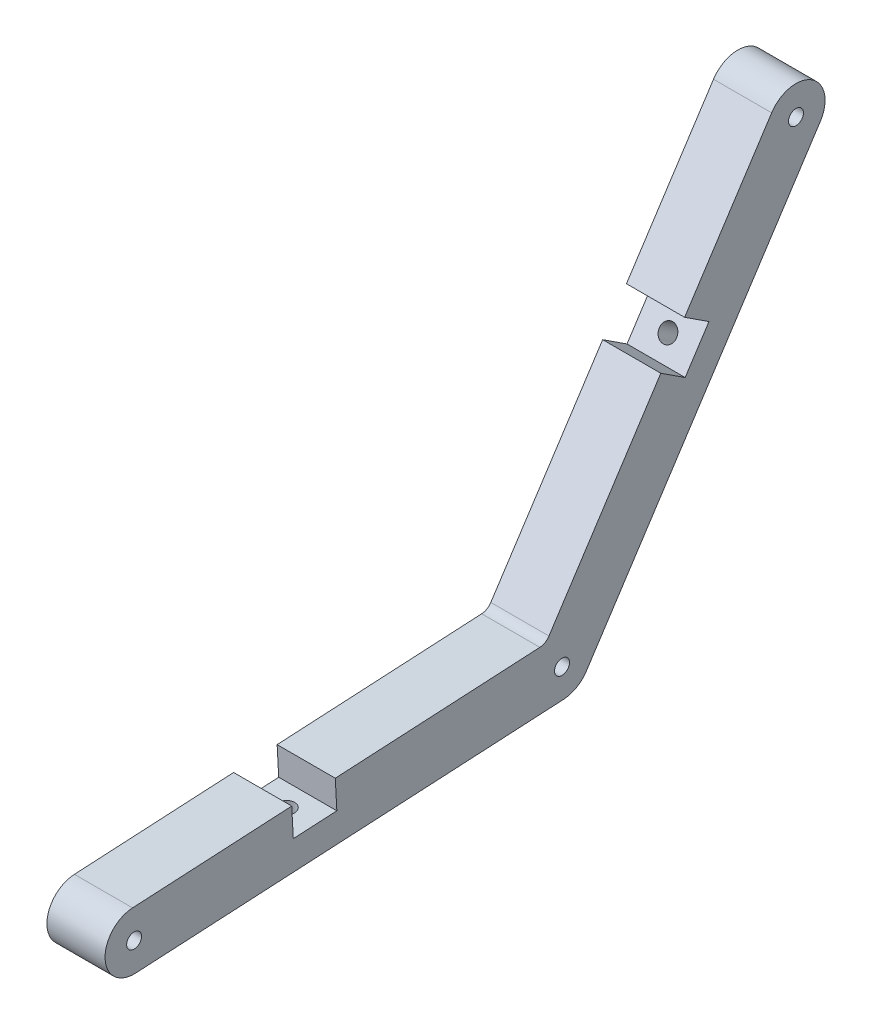
ISO-10303-21;
HEADER;
FILE_DESCRIPTION(('STEP AP214'),'2;1');
FILE_NAME('part.step','',(''),(''),'','','');
FILE_SCHEMA(('AUTOMOTIVE_DESIGN { 1 0 10303 214 1 1 1 1 }'));
ENDSEC;
DATA;
#1=APPLICATION_CONTEXT('core data for automotive mechanical design processes');
#2=APPLICATION_PROTOCOL_DEFINITION('international standard','automotive_design',2000,#1);
#3=PRODUCT_CONTEXT('',#1,'mechanical');
#4=PRODUCT('Part','Part','',(#3));
#5=PRODUCT_RELATED_PRODUCT_CATEGORY('part','',(#4));
#6=PRODUCT_DEFINITION_FORMATION('','',#4);
#7=PRODUCT_DEFINITION_CONTEXT('part definition',#1,'design');
#8=PRODUCT_DEFINITION('design','',#6,#7);
#9=PRODUCT_DEFINITION_SHAPE('','',#8);
#10=(LENGTH_UNIT() NAMED_UNIT(*) SI_UNIT(.MILLI.,.METRE.));
#11=(NAMED_UNIT(*) PLANE_ANGLE_UNIT() SI_UNIT($,.RADIAN.));
#12=(NAMED_UNIT(*) SI_UNIT($,.STERADIAN.) SOLID_ANGLE_UNIT());
#13=UNCERTAINTY_MEASURE_WITH_UNIT(LENGTH_MEASURE(1.E-05),#10,'distance_accuracy_value','');
#14=(GEOMETRIC_REPRESENTATION_CONTEXT(3) GLOBAL_UNCERTAINTY_ASSIGNED_CONTEXT((#13)) GLOBAL_UNIT_ASSIGNED_CONTEXT((#10,
#11,#12)) REPRESENTATION_CONTEXT('',''));
#15=CARTESIAN_POINT('',(0.,0.,0.));
#16=DIRECTION('',(0.,0.,1.));
#17=DIRECTION('',(1.,0.,0.));
#18=AXIS2_PLACEMENT_3D('',#15,#16,#17);
#19=CARTESIAN_POINT('',(12.7,6.16702536134779,3.56053375247341));
#20=DIRECTION('',(0.,-0.545958862919398,-0.837811983681158));
#21=DIRECTION('',(0.,0.837811983681158,-0.545958862919398));
#22=AXIS2_PLACEMENT_3D('',#19,#20,#21);
#23=PLANE('',#22);
#24=DIRECTION('',(0.,-0.837811983681158,0.545958862919398));
#25=VECTOR('',#24,1.);
#26=CARTESIAN_POINT('',(0.,6.16702536134779,3.56053375247341));
#27=LINE('',#26,#25);
#28=CARTESIAN_POINT('',(0.,81.8928403220774,-45.7860745974717));
#29=VERTEX_POINT('',#28);
#30=CARTESIAN_POINT('',(0.,52.7179537046322,-26.7743055684857));
#31=VERTEX_POINT('',#30);
#32=EDGE_CURVE('E176',#29,#31,#27,.T.);
#33=ORIENTED_EDGE('',*,*,#32,.T.);
#34=DIRECTION('',(1.,0.,0.));
#35=VECTOR('',#34,1.);
#36=CARTESIAN_POINT('',(0.,52.7179537046322,-26.7743055684857));
#37=LINE('',#36,#35);
#38=CARTESIAN_POINT('',(12.7,52.7179537046322,-26.7743055684857));
#39=VERTEX_POINT('',#38);
#40=EDGE_CURVE('E222',#31,#39,#37,.T.);
#41=ORIENTED_EDGE('',*,*,#40,.T.);
#42=DIRECTION('',(0.,-0.837811983681158,0.545958862919398));
#43=VECTOR('',#42,1.);
#44=CARTESIAN_POINT('',(12.7,6.16702536134779,3.56053375247341));
#45=LINE('',#44,#43);
#46=CARTESIAN_POINT('',(12.7,81.8928403220774,-45.7860745974717));
#47=VERTEX_POINT('',#46);
#48=EDGE_CURVE('E269',#47,#39,#45,.T.);
#49=ORIENTED_EDGE('',*,*,#48,.F.);
#50=DIRECTION('',(-1.,0.,0.));
#51=VECTOR('',#50,1.);
#52=CARTESIAN_POINT('',(12.7,81.8928403220774,-45.7860745974717));
#53=LINE('',#52,#51);
#54=EDGE_CURVE('E186',#47,#29,#53,.T.);
#55=ORIENTED_EDGE('',*,*,#54,.T.);
#56=EDGE_LOOP('',(#33,#41,#49,#55));
#57=FACE_BOUND('',#56,.T.);
#58=ADVANCED_FACE('F37',(#57),#23,.F.);
#59=CARTESIAN_POINT('',(12.7,1.2945164200586,93.8143174057174));
#60=DIRECTION('',(0.,-0.998545892922616,-0.0539082528688887));
#61=DIRECTION('',(0.,0.0539082528688887,-0.998545892922616));
#62=AXIS2_PLACEMENT_3D('',#59,#60,#61);
#63=PLANE('',#62);
#64=DIRECTION('',(0.,-0.0539082528688887,0.998545892922616));
#65=VECTOR('',#64,1.);
#66=CARTESIAN_POINT('',(12.7,1.2945164200586,93.8143174057174));
#67=LINE('',#66,#65);
#68=CARTESIAN_POINT('',(12.7,6.09752893786347,4.84782029117577));
#69=VERTEX_POINT('',#68);
#70=CARTESIAN_POINT('',(12.7,3.68522416989633,49.5310902978983));
#71=VERTEX_POINT('',#70);
#72=EDGE_CURVE('E187',#69,#71,#67,.T.);
#73=ORIENTED_EDGE('',*,*,#72,.F.);
#74=DIRECTION('',(-1.,0.,0.));
#75=VECTOR('',#74,1.);
#76=CARTESIAN_POINT('',(0.,6.09752893786347,4.84782029117579));
#77=LINE('',#76,#75);
#78=CARTESIAN_POINT('',(0.,6.09752893786347,4.84782029117577));
#79=VERTEX_POINT('',#78);
#80=EDGE_CURVE('E202',#69,#79,#77,.T.);
#81=ORIENTED_EDGE('',*,*,#80,.T.);
#82=DIRECTION('',(0.,-0.0539082528688887,0.998545892922616));
#83=VECTOR('',#82,1.);
#84=CARTESIAN_POINT('',(0.,1.2945164200586,93.8143174057174));
#85=LINE('',#84,#83);
#86=CARTESIAN_POINT('',(0.,3.68522416989633,49.5310902978983));
#87=VERTEX_POINT('',#86);
#88=EDGE_CURVE('E175',#79,#87,#85,.T.);
#89=ORIENTED_EDGE('',*,*,#88,.T.);
#90=DIRECTION('',(1.,0.,0.));
#91=VECTOR('',#90,1.);
#92=CARTESIAN_POINT('',(0.,3.68522416989633,49.5310902978983));
#93=LINE('',#92,#91);
#94=EDGE_CURVE('E227',#87,#71,#93,.T.);
#95=ORIENTED_EDGE('',*,*,#94,.T.);
#96=EDGE_LOOP('',(#73,#81,#89,#95));
#97=FACE_BOUND('',#96,.T.);
#98=ADVANCED_FACE('F208',(#97),#63,.F.);
#99=CARTESIAN_POINT('',(12.7,-5.04625000000001,93.472));
#100=DIRECTION('',(-1.,0.,0.));
#101=DIRECTION('',(0.,0.,1.));
#102=AXIS2_PLACEMENT_3D('',#99,#100,#101);
#103=CYLINDRICAL_SURFACE('',#102,6.35);
#104=CARTESIAN_POINT('',(0.,-5.04625000000001,93.472));
#105=DIRECTION('',(1.,0.,0.));
#106=DIRECTION('',(0.,0.,-1.));
#107=AXIS2_PLACEMENT_3D('',#104,#105,#106);
#108=CIRCLE('',#107,6.35);
#109=CARTESIAN_POINT('',(0.,1.2945164200586,93.8143174057174));
#110=VERTEX_POINT('',#109);
#111=CARTESIAN_POINT('',(0.,-11.3870164200586,93.1296825942826));
#112=VERTEX_POINT('',#111);
#113=EDGE_CURVE('E174',#110,#112,#108,.T.);
#114=ORIENTED_EDGE('',*,*,#113,.T.);
#115=DIRECTION('',(-1.,0.,0.));
#116=VECTOR('',#115,1.);
#117=CARTESIAN_POINT('',(12.7,-11.3870164200586,93.1296825942826));
#118=LINE('',#117,#116);
#119=CARTESIAN_POINT('',(12.7,-11.3870164200586,93.1296825942826));
#120=VERTEX_POINT('',#119);
#121=EDGE_CURVE('E199',#120,#112,#118,.T.);
#122=ORIENTED_EDGE('',*,*,#121,.F.);
#123=CARTESIAN_POINT('',(12.7,-5.04625000000001,93.472));
#124=DIRECTION('',(1.,0.,0.));
#125=DIRECTION('',(0.,0.,-1.));
#126=AXIS2_PLACEMENT_3D('',#123,#124,#125);
#127=CIRCLE('',#126,6.35);
#128=CARTESIAN_POINT('',(12.7,1.2945164200586,93.8143174057174));
#129=VERTEX_POINT('',#128);
#130=EDGE_CURVE('E178',#129,#120,#127,.T.);
#131=ORIENTED_EDGE('',*,*,#130,.F.);
#132=DIRECTION('',(-1.,0.,0.));
#133=VECTOR('',#132,1.);
#134=CARTESIAN_POINT('',(12.7,1.2945164200586,93.8143174057174));
#135=LINE('',#134,#133);
#136=EDGE_CURVE('E184',#129,#110,#135,.T.);
#137=ORIENTED_EDGE('',*,*,#136,.T.);
#138=EDGE_LOOP('',(#114,#122,#131,#137));
#139=FACE_BOUND('',#138,.T.);
#140=ADVANCED_FACE('F320',(#139),#103,.T.);
#141=CARTESIAN_POINT('',(12.7,-11.3870164200586,93.1296825942826));
#142=DIRECTION('',(0.,0.998545892922616,0.0539082528688887));
#143=DIRECTION('',(0.,-0.0539082528688887,0.998545892922616));
#144=AXIS2_PLACEMENT_3D('',#141,#142,#143);
#145=PLANE('',#144);
#146=CARTESIAN_POINT('',(6.35,-9.25304672450897,53.6020303015074));
#147=DIRECTION('',(0.,0.998545892922616,0.0539082528688887));
#148=DIRECTION('',(0.,-0.0539082528688887,0.998545892922616));
#149=AXIS2_PLACEMENT_3D('',#146,#147,#148);
#150=CIRCLE('',#149,1.89864999999999);
#151=CARTESIAN_POINT('',(6.35,-9.35539962881849,55.4979194611049));
#152=VERTEX_POINT('',#151);
#153=EDGE_CURVE('E543',#152,#152,#150,.T.);
#154=ORIENTED_EDGE('',*,*,#153,.T.);
#155=EDGE_LOOP('',(#154));
#156=FACE_BOUND('',#155,.T.);
#157=DIRECTION('',(0.,0.0539082528688886,-0.998545892922616));
#158=VECTOR('',#157,1.);
#159=CARTESIAN_POINT('',(0.,-11.3870164200586,93.1296825942826));
#160=LINE('',#159,#158);
#161=CARTESIAN_POINT('',(0.,-6.34076642005861,-0.342317405717442));
#162=VERTEX_POINT('',#161);
#163=EDGE_CURVE('E274',#112,#162,#160,.T.);
#164=ORIENTED_EDGE('',*,*,#163,.T.);
#165=DIRECTION('',(-1.,0.,0.));
#166=VECTOR('',#165,1.);
#167=CARTESIAN_POINT('',(12.7,-6.34076642005861,-0.342317405717442));
#168=LINE('',#167,#166);
#169=CARTESIAN_POINT('',(12.7,-6.34076642005861,-0.342317405717442));
#170=VERTEX_POINT('',#169);
#171=EDGE_CURVE('E196',#170,#162,#168,.T.);
#172=ORIENTED_EDGE('',*,*,#171,.F.);
#173=DIRECTION('',(0.,0.0539082528688886,-0.998545892922616));
#174=VECTOR('',#173,1.);
#175=CARTESIAN_POINT('',(12.7,-11.3870164200586,93.1296825942826));
#176=LINE('',#175,#174);
#177=EDGE_CURVE('E260',#120,#170,#176,.T.);
#178=ORIENTED_EDGE('',*,*,#177,.F.);
#179=ORIENTED_EDGE('',*,*,#121,.T.);
#180=EDGE_LOOP('',(#164,#172,#178,#179));
#181=FACE_BOUND('',#180,.T.);
#182=ADVANCED_FACE('F316',(#156,#181),#145,.F.);
#183=CARTESIAN_POINT('',(12.7,0.,0.));
#184=DIRECTION('',(-1.,0.,0.));
#185=DIRECTION('',(0.,0.,1.));
#186=AXIS2_PLACEMENT_3D('',#183,#184,#185);
#187=CYLINDRICAL_SURFACE('',#186,6.35);
#188=CARTESIAN_POINT('',(0.,0.,0.));
#189=DIRECTION('',(1.,0.,0.));
#190=DIRECTION('',(0.,0.,-1.));
#191=AXIS2_PLACEMENT_3D('',#188,#189,#190);
#192=CIRCLE('',#191,6.35);
#193=CARTESIAN_POINT('',(0.,-3.46683877953818,-5.32010609637536));
#194=VERTEX_POINT('',#193);
#195=EDGE_CURVE('E276',#162,#194,#192,.T.);
#196=ORIENTED_EDGE('',*,*,#195,.T.);
#197=DIRECTION('',(-1.,0.,0.));
#198=VECTOR('',#197,1.);
#199=CARTESIAN_POINT('',(12.7,-3.46683877953818,-5.32010609637536));
#200=LINE('',#199,#198);
#201=CARTESIAN_POINT('',(12.7,-3.46683877953818,-5.32010609637536));
#202=VERTEX_POINT('',#201);
#203=EDGE_CURVE('E193',#202,#194,#200,.T.);
#204=ORIENTED_EDGE('',*,*,#203,.F.);
#205=CARTESIAN_POINT('',(12.7,0.,0.));
#206=DIRECTION('',(1.,0.,0.));
#207=DIRECTION('',(0.,0.,-1.));
#208=AXIS2_PLACEMENT_3D('',#205,#206,#207);
#209=CIRCLE('',#208,6.35);
#210=EDGE_CURVE('E262',#170,#202,#209,.T.);
#211=ORIENTED_EDGE('',*,*,#210,.F.);
#212=ORIENTED_EDGE('',*,*,#171,.T.);
#213=EDGE_LOOP('',(#196,#204,#211,#212));
#214=FACE_BOUND('',#213,.T.);
#215=ADVANCED_FACE('F313',(#214),#187,.T.);
#216=CARTESIAN_POINT('',(12.7,74.959162763001,-56.4262867902224));
#217=DIRECTION('',(0.,0.545958862919398,0.837811983681158));
#218=DIRECTION('',(0.,-0.837811983681158,0.545958862919398));
#219=AXIS2_PLACEMENT_3D('',#216,#217,#218);
#220=PLANE('',#219);
#221=CARTESIAN_POINT('',(6.35,41.7941965732743,-34.8143886765828));
#222=DIRECTION('',(0.,0.545958862919398,0.837811983681158));
#223=DIRECTION('',(0.,-0.837811983681158,0.545958862919398));
#224=AXIS2_PLACEMENT_3D('',#221,#222,#223);
#225=CIRCLE('',#224,1.89864999999999);
#226=CARTESIAN_POINT('',(6.35,40.2034848504581,-33.7778038815008));
#227=VERTEX_POINT('',#226);
#228=EDGE_CURVE('E513',#227,#227,#225,.T.);
#229=ORIENTED_EDGE('',*,*,#228,.T.);
#230=EDGE_LOOP('',(#229));
#231=FACE_BOUND('',#230,.T.);
#232=DIRECTION('',(0.,0.837811983681158,-0.545958862919398));
#233=VECTOR('',#232,1.);
#234=CARTESIAN_POINT('',(0.,74.959162763001,-56.4262867902224));
#235=LINE('',#234,#233);
#236=CARTESIAN_POINT('',(0.,74.959162763001,-56.4262867902224));
#237=VERTEX_POINT('',#236);
#238=EDGE_CURVE('E278',#194,#237,#235,.T.);
#239=ORIENTED_EDGE('',*,*,#238,.T.);
#240=DIRECTION('',(-1.,0.,0.));
#241=VECTOR('',#240,1.);
#242=CARTESIAN_POINT('',(12.7,74.959162763001,-56.4262867902224));
#243=LINE('',#242,#241);
#244=CARTESIAN_POINT('',(12.7,74.959162763001,-56.4262867902224));
#245=VERTEX_POINT('',#244);
#246=EDGE_CURVE('E190',#245,#237,#243,.T.);
#247=ORIENTED_EDGE('',*,*,#246,.F.);
#248=DIRECTION('',(0.,0.837811983681158,-0.545958862919398));
#249=VECTOR('',#248,1.);
#250=CARTESIAN_POINT('',(12.7,74.959162763001,-56.4262867902224));
#251=LINE('',#250,#249);
#252=EDGE_CURVE('E264',#202,#245,#251,.T.);
#253=ORIENTED_EDGE('',*,*,#252,.F.);
#254=ORIENTED_EDGE('',*,*,#203,.T.);
#255=EDGE_LOOP('',(#239,#247,#253,#254));
#256=FACE_BOUND('',#255,.T.);
#257=ADVANCED_FACE('F309',(#231,#256),#220,.F.);
#258=CARTESIAN_POINT('',(12.7,78.4260015425392,-51.106180693847));
#259=DIRECTION('',(-1.,0.,0.));
#260=DIRECTION('',(0.,0.,1.));
#261=AXIS2_PLACEMENT_3D('',#258,#259,#260);
#262=CYLINDRICAL_SURFACE('',#261,6.35);
#263=CARTESIAN_POINT('',(0.,78.4260015425392,-51.106180693847));
#264=DIRECTION('',(1.,0.,0.));
#265=DIRECTION('',(0.,0.,-1.));
#266=AXIS2_PLACEMENT_3D('',#263,#264,#265);
#267=CIRCLE('',#266,6.35);
#268=EDGE_CURVE('E279',#237,#29,#267,.T.);
#269=ORIENTED_EDGE('',*,*,#268,.T.);
#270=ORIENTED_EDGE('',*,*,#54,.F.);
#271=CARTESIAN_POINT('',(12.7,78.4260015425392,-51.106180693847));
#272=DIRECTION('',(1.,0.,0.));
#273=DIRECTION('',(0.,0.,-1.));
#274=AXIS2_PLACEMENT_3D('',#271,#272,#273);
#275=CIRCLE('',#274,6.35);
#276=EDGE_CURVE('E266',#245,#47,#275,.T.);
#277=ORIENTED_EDGE('',*,*,#276,.F.);
#278=ORIENTED_EDGE('',*,*,#246,.T.);
#279=EDGE_LOOP('',(#269,#270,#277,#278));
#280=FACE_BOUND('',#279,.T.);
#281=ADVANCED_FACE('F305',(#280),#262,.T.);
#282=CARTESIAN_POINT('',(0.,44.7377945600691,-21.5740473991784));
#283=VERTEX_POINT('',#282);
#284=CARTESIAN_POINT('',(0.,7.24709999407165,2.85670481491263));
#285=VERTEX_POINT('',#284);
#286=EDGE_CURVE('E180',#283,#285,#27,.T.);
#287=ORIENTED_EDGE('',*,*,#286,.T.);
#288=DIRECTION('',(-1.,0.,0.));
#289=VECTOR('',#288,1.);
#290=CARTESIAN_POINT('',(12.7,7.24709999407165,2.85670481491263));
#291=LINE('',#290,#289);
#292=CARTESIAN_POINT('',(12.7,7.24709999407165,2.85670481491263));
#293=VERTEX_POINT('',#292);
#294=EDGE_CURVE('E58',#285,#293,#291,.F.);
#295=ORIENTED_EDGE('',*,*,#294,.T.);
#296=CARTESIAN_POINT('',(12.7,44.7377945600691,-21.5740473991784));
#297=VERTEX_POINT('',#296);
#298=EDGE_CURVE('E268',#297,#293,#45,.T.);
#299=ORIENTED_EDGE('',*,*,#298,.F.);
#300=DIRECTION('',(1.,0.,0.));
#301=VECTOR('',#300,1.);
#302=CARTESIAN_POINT('',(0.,44.7377945600691,-21.5740473991784));
#303=LINE('',#302,#301);
#304=EDGE_CURVE('E242',#283,#297,#303,.T.);
#305=ORIENTED_EDGE('',*,*,#304,.F.);
#306=EDGE_LOOP('',(#287,#295,#299,#305));
#307=FACE_BOUND('',#306,.T.);
#308=ADVANCED_FACE('F284',(#307),#23,.F.);
#309=CARTESIAN_POINT('',(12.7,3.17174806132017,59.0422399279862));
#310=VERTEX_POINT('',#309);
#311=EDGE_CURVE('E168',#310,#129,#67,.T.);
#312=ORIENTED_EDGE('',*,*,#311,.F.);
#313=DIRECTION('',(1.,0.,0.));
#314=VECTOR('',#313,1.);
#315=CARTESIAN_POINT('',(0.,3.17174806132017,59.0422399279862));
#316=LINE('',#315,#314);
#317=CARTESIAN_POINT('',(0.,3.17174806132017,59.0422399279862));
#318=VERTEX_POINT('',#317);
#319=EDGE_CURVE('E154',#318,#310,#316,.T.);
#320=ORIENTED_EDGE('',*,*,#319,.F.);
#321=EDGE_CURVE('E166',#318,#110,#85,.T.);
#322=ORIENTED_EDGE('',*,*,#321,.T.);
#323=ORIENTED_EDGE('',*,*,#136,.F.);
#324=EDGE_LOOP('',(#312,#320,#322,#323));
#325=FACE_BOUND('',#324,.T.);
#326=ADVANCED_FACE('F164',(#325),#63,.F.);
#327=CARTESIAN_POINT('',(12.7,-5.04625000000001,93.472));
#328=DIRECTION('',(1.,0.,0.));
#329=DIRECTION('',(0.,0.,-1.));
#330=AXIS2_PLACEMENT_3D('',#327,#328,#329);
#331=PLANE('',#330);
#332=CARTESIAN_POINT('',(12.7,-5.04625000000001,93.472));
#333=DIRECTION('',(1.,0.,0.));
#334=DIRECTION('',(0.,0.,-1.));
#335=AXIS2_PLACEMENT_3D('',#332,#333,#334);
#336=CIRCLE('',#335,1.63195);
#337=CARTESIAN_POINT('',(12.7,-5.04625000000001,91.84005));
#338=VERTEX_POINT('',#337);
#339=EDGE_CURVE('E512',#338,#338,#336,.T.);
#340=ORIENTED_EDGE('',*,*,#339,.F.);
#341=EDGE_LOOP('',(#340));
#342=FACE_BOUND('',#341,.T.);
#343=CARTESIAN_POINT('',(12.7,0.,0.));
#344=DIRECTION('',(1.,0.,0.));
#345=DIRECTION('',(0.,0.,-1.));
#346=AXIS2_PLACEMENT_3D('',#343,#344,#345);
#347=CIRCLE('',#346,1.63195);
#348=CARTESIAN_POINT('',(12.7,0.,-1.63195));
#349=VERTEX_POINT('',#348);
#350=EDGE_CURVE('E515',#349,#349,#347,.T.);
#351=ORIENTED_EDGE('',*,*,#350,.F.);
#352=EDGE_LOOP('',(#351));
#353=FACE_BOUND('',#352,.T.);
#354=CARTESIAN_POINT('',(12.7,78.4260015425392,-51.106180693847));
#355=DIRECTION('',(1.,0.,0.));
#356=DIRECTION('',(0.,0.,-1.));
#357=AXIS2_PLACEMENT_3D('',#354,#355,#356);
#358=CIRCLE('',#357,1.63194999999999);
#359=CARTESIAN_POINT('',(12.7,78.4260015425392,-52.738130693847));
#360=VERTEX_POINT('',#359);
#361=EDGE_CURVE('E527',#360,#360,#358,.T.);
#362=ORIENTED_EDGE('',*,*,#361,.F.);
#363=EDGE_LOOP('',(#362));
#364=FACE_BOUND('',#363,.T.);
#365=DIRECTION('',(0.,0.998545892922616,0.0539082528688894));
#366=VECTOR('',#365,1.);
#367=CARTESIAN_POINT('',(12.7,-2.65554225016227,49.1887728921809));
#368=LINE('',#367,#366);
#369=CARTESIAN_POINT('',(12.7,-2.65554225016227,49.1887728921809));
#370=VERTEX_POINT('',#369);
#371=EDGE_CURVE('E160',#370,#71,#368,.T.);
#372=ORIENTED_EDGE('',*,*,#371,.F.);
#373=DIRECTION('',(0.,0.0539082528688888,-0.998545892922616));
#374=VECTOR('',#373,1.);
#375=CARTESIAN_POINT('',(12.7,-3.16901835873844,58.6999225222688));
#376=LINE('',#375,#374);
#377=CARTESIAN_POINT('',(12.7,-3.16901835873844,58.6999225222688));
#378=VERTEX_POINT('',#377);
#379=EDGE_CURVE('E221',#378,#370,#376,.T.);
#380=ORIENTED_EDGE('',*,*,#379,.F.);
#381=DIRECTION('',(0.,-0.998545892922616,-0.0539082528688883));
#382=VECTOR('',#381,1.);
#383=CARTESIAN_POINT('',(12.7,3.17174806132017,59.0422399279862));
#384=LINE('',#383,#382);
#385=EDGE_CURVE('E219',#310,#378,#384,.T.);
#386=ORIENTED_EDGE('',*,*,#385,.F.);
#387=ORIENTED_EDGE('',*,*,#311,.T.);
#388=ORIENTED_EDGE('',*,*,#130,.T.);
#389=ORIENTED_EDGE('',*,*,#177,.T.);
#390=ORIENTED_EDGE('',*,*,#210,.T.);
#391=ORIENTED_EDGE('',*,*,#252,.T.);
#392=ORIENTED_EDGE('',*,*,#276,.T.);
#393=ORIENTED_EDGE('',*,*,#48,.T.);
#394=DIRECTION('',(0.,0.545958862919399,0.837811983681158));
#395=VECTOR('',#394,1.);
#396=CARTESIAN_POINT('',(12.7,49.251114925094,-32.094411664861));
#397=LINE('',#396,#395);
#398=CARTESIAN_POINT('',(12.7,49.251114925094,-32.094411664861));
#399=VERTEX_POINT('',#398);
#400=EDGE_CURVE('E236',#399,#39,#397,.T.);
#401=ORIENTED_EDGE('',*,*,#400,.F.);
#402=DIRECTION('',(0.,0.837811983681158,-0.545958862919398));
#403=VECTOR('',#402,1.);
#404=CARTESIAN_POINT('',(12.7,41.2709557805309,-26.8941534955537));
#405=LINE('',#404,#403);
#406=CARTESIAN_POINT('',(12.7,41.2709557805309,-26.8941534955537));
#407=VERTEX_POINT('',#406);
#408=EDGE_CURVE('E246',#407,#399,#405,.T.);
#409=ORIENTED_EDGE('',*,*,#408,.F.);
#410=DIRECTION('',(0.,-0.545958862919398,-0.837811983681159));
#411=VECTOR('',#410,1.);
#412=CARTESIAN_POINT('',(12.7,44.7377945600691,-21.5740473991784));
#413=LINE('',#412,#411);
#414=EDGE_CURVE('E243',#297,#407,#413,.T.);
#415=ORIENTED_EDGE('',*,*,#414,.F.);
#416=ORIENTED_EDGE('',*,*,#298,.T.);
#417=CARTESIAN_POINT('',(12.7,8.63383550588691,4.98474725346276));
#418=DIRECTION('',(1.,0.,0.));
#419=DIRECTION('',(0.,0.,-1.));
#420=AXIS2_PLACEMENT_3D('',#417,#418,#419);
#421=CIRCLE('',#420,2.54);
#422=EDGE_CURVE('E11',#293,#69,#421,.F.);
#423=ORIENTED_EDGE('',*,*,#422,.T.);
#424=ORIENTED_EDGE('',*,*,#72,.T.);
#425=EDGE_LOOP('',(#372,#380,#386,#387,#388,#389,#390,#391,#392,#393,#401,#409,#415,#416,#423,#424));
#426=FACE_BOUND('',#425,.T.);
#427=ADVANCED_FACE('F287',(#342,#353,#364,#426),#331,.T.);
#428=CARTESIAN_POINT('',(0.,-5.04625000000001,93.472));
#429=DIRECTION('',(1.,0.,0.));
#430=DIRECTION('',(0.,0.,-1.));
#431=AXIS2_PLACEMENT_3D('',#428,#429,#430);
#432=PLANE('',#431);
#433=CARTESIAN_POINT('',(0.,-5.04625000000001,93.472));
#434=DIRECTION('',(1.,0.,0.));
#435=DIRECTION('',(0.,0.,-1.));
#436=AXIS2_PLACEMENT_3D('',#433,#434,#435);
#437=CIRCLE('',#436,1.63195);
#438=CARTESIAN_POINT('',(0.,-5.04625000000001,91.84005));
#439=VERTEX_POINT('',#438);
#440=EDGE_CURVE('E509',#439,#439,#437,.T.);
#441=ORIENTED_EDGE('',*,*,#440,.T.);
#442=EDGE_LOOP('',(#441));
#443=FACE_BOUND('',#442,.T.);
#444=CARTESIAN_POINT('',(0.,0.,0.));
#445=DIRECTION('',(1.,0.,0.));
#446=DIRECTION('',(0.,0.,-1.));
#447=AXIS2_PLACEMENT_3D('',#444,#445,#446);
#448=CIRCLE('',#447,1.63195);
#449=CARTESIAN_POINT('',(0.,0.,-1.63195));
#450=VERTEX_POINT('',#449);
#451=EDGE_CURVE('E524',#450,#450,#448,.T.);
#452=ORIENTED_EDGE('',*,*,#451,.T.);
#453=EDGE_LOOP('',(#452));
#454=FACE_BOUND('',#453,.T.);
#455=CARTESIAN_POINT('',(0.,78.4260015425392,-51.106180693847));
#456=DIRECTION('',(1.,0.,0.));
#457=DIRECTION('',(0.,0.,-1.));
#458=AXIS2_PLACEMENT_3D('',#455,#456,#457);
#459=CIRCLE('',#458,1.63194999999999);
#460=CARTESIAN_POINT('',(0.,78.4260015425392,-52.738130693847));
#461=VERTEX_POINT('',#460);
#462=EDGE_CURVE('E247',#461,#461,#459,.T.);
#463=ORIENTED_EDGE('',*,*,#462,.T.);
#464=EDGE_LOOP('',(#463));
#465=FACE_BOUND('',#464,.T.);
#466=DIRECTION('',(0.,0.0539082528688888,-0.998545892922616));
#467=VECTOR('',#466,1.);
#468=CARTESIAN_POINT('',(0.,-3.16901835873844,58.6999225222688));
#469=LINE('',#468,#467);
#470=CARTESIAN_POINT('',(0.,-3.16901835873844,58.6999225222688));
#471=VERTEX_POINT('',#470);
#472=CARTESIAN_POINT('',(0.,-2.65554225016227,49.1887728921809));
#473=VERTEX_POINT('',#472);
#474=EDGE_CURVE('E159',#471,#473,#469,.T.);
#475=ORIENTED_EDGE('',*,*,#474,.T.);
#476=DIRECTION('',(0.,0.998545892922616,0.0539082528688894));
#477=VECTOR('',#476,1.);
#478=CARTESIAN_POINT('',(0.,-2.65554225016227,49.1887728921809));
#479=LINE('',#478,#477);
#480=EDGE_CURVE('E169',#473,#87,#479,.T.);
#481=ORIENTED_EDGE('',*,*,#480,.T.);
#482=ORIENTED_EDGE('',*,*,#88,.F.);
#483=CARTESIAN_POINT('',(0.,8.63383550588691,4.98474725346276));
#484=DIRECTION('',(1.,0.,0.));
#485=DIRECTION('',(0.,0.,-1.));
#486=AXIS2_PLACEMENT_3D('',#483,#484,#485);
#487=CIRCLE('',#486,2.54);
#488=EDGE_CURVE('E45',#79,#285,#487,.T.);
#489=ORIENTED_EDGE('',*,*,#488,.T.);
#490=ORIENTED_EDGE('',*,*,#286,.F.);
#491=DIRECTION('',(0.,-0.545958862919398,-0.837811983681159));
#492=VECTOR('',#491,1.);
#493=CARTESIAN_POINT('',(0.,44.7377945600691,-21.5740473991784));
#494=LINE('',#493,#492);
#495=CARTESIAN_POINT('',(0.,41.270955780531,-26.8941534955537));
#496=VERTEX_POINT('',#495);
#497=EDGE_CURVE('E232',#283,#496,#494,.T.);
#498=ORIENTED_EDGE('',*,*,#497,.T.);
#499=DIRECTION('',(0.,0.837811983681158,-0.545958862919398));
#500=VECTOR('',#499,1.);
#501=CARTESIAN_POINT('',(0.,41.2709557805309,-26.8941534955537));
#502=LINE('',#501,#500);
#503=CARTESIAN_POINT('',(0.,49.251114925094,-32.094411664861));
#504=VERTEX_POINT('',#503);
#505=EDGE_CURVE('E235',#496,#504,#502,.T.);
#506=ORIENTED_EDGE('',*,*,#505,.T.);
#507=DIRECTION('',(0.,0.545958862919399,0.837811983681158));
#508=VECTOR('',#507,1.);
#509=CARTESIAN_POINT('',(0.,49.251114925094,-32.094411664861));
#510=LINE('',#509,#508);
#511=EDGE_CURVE('E239',#504,#31,#510,.T.);
#512=ORIENTED_EDGE('',*,*,#511,.T.);
#513=ORIENTED_EDGE('',*,*,#32,.F.);
#514=ORIENTED_EDGE('',*,*,#268,.F.);
#515=ORIENTED_EDGE('',*,*,#238,.F.);
#516=ORIENTED_EDGE('',*,*,#195,.F.);
#517=ORIENTED_EDGE('',*,*,#163,.F.);
#518=ORIENTED_EDGE('',*,*,#113,.F.);
#519=ORIENTED_EDGE('',*,*,#321,.F.);
#520=DIRECTION('',(0.,-0.998545892922616,-0.0539082528688883));
#521=VECTOR('',#520,1.);
#522=CARTESIAN_POINT('',(0.,3.17174806132017,59.0422399279862));
#523=LINE('',#522,#521);
#524=EDGE_CURVE('E150',#318,#471,#523,.T.);
#525=ORIENTED_EDGE('',*,*,#524,.T.);
#526=EDGE_LOOP('',(#475,#481,#482,#489,#490,#498,#506,#512,#513,#514,#515,#516,#517,#518,#519,#525));
#527=FACE_BOUND('',#526,.T.);
#528=ADVANCED_FACE('F172',(#443,#454,#465,#527),#432,.F.);
#529=CARTESIAN_POINT('',(0.,49.251114925094,-32.094411664861));
#530=DIRECTION('',(0.,0.837811983681158,-0.545958862919399));
#531=DIRECTION('',(0.,0.545958862919399,0.837811983681158));
#532=AXIS2_PLACEMENT_3D('',#529,#530,#531);
#533=PLANE('',#532);
#534=ORIENTED_EDGE('',*,*,#400,.T.);
#535=ORIENTED_EDGE('',*,*,#40,.F.);
#536=ORIENTED_EDGE('',*,*,#511,.F.);
#537=DIRECTION('',(1.,0.,0.));
#538=VECTOR('',#537,1.);
#539=CARTESIAN_POINT('',(0.,49.251114925094,-32.094411664861));
#540=LINE('',#539,#538);
#541=EDGE_CURVE('E253',#504,#399,#540,.T.);
#542=ORIENTED_EDGE('',*,*,#541,.T.);
#543=EDGE_LOOP('',(#534,#535,#536,#542));
#544=FACE_BOUND('',#543,.T.);
#545=ADVANCED_FACE('F299',(#544),#533,.F.);
#546=CARTESIAN_POINT('',(0.,41.2709557805309,-26.8941534955537));
#547=DIRECTION('',(0.,-0.545958862919398,-0.837811983681158));
#548=DIRECTION('',(0.,0.837811983681159,-0.545958862919398));
#549=AXIS2_PLACEMENT_3D('',#546,#547,#548);
#550=PLANE('',#549);
#551=CARTESIAN_POINT('',(6.35,45.2610353528125,-29.4942825802074));
#552=DIRECTION('',(0.,0.545958862919398,0.837811983681158));
#553=DIRECTION('',(0.,-0.837811983681159,0.545958862919398));
#554=AXIS2_PLACEMENT_3D('',#551,#552,#553);
#555=CIRCLE('',#554,1.89864999999999);
#556=CARTESIAN_POINT('',(6.35,43.6703236299963,-28.4576977851255));
#557=VERTEX_POINT('',#556);
#558=EDGE_CURVE('E518',#557,#557,#555,.T.);
#559=ORIENTED_EDGE('',*,*,#558,.F.);
#560=EDGE_LOOP('',(#559));
#561=FACE_BOUND('',#560,.T.);
#562=ORIENTED_EDGE('',*,*,#408,.T.);
#563=ORIENTED_EDGE('',*,*,#541,.F.);
#564=ORIENTED_EDGE('',*,*,#505,.F.);
#565=DIRECTION('',(1.,0.,0.));
#566=VECTOR('',#565,1.);
#567=CARTESIAN_POINT('',(0.,41.2709557805309,-26.8941534955537));
#568=LINE('',#567,#566);
#569=EDGE_CURVE('E255',#496,#407,#568,.T.);
#570=ORIENTED_EDGE('',*,*,#569,.T.);
#571=EDGE_LOOP('',(#562,#563,#564,#570));
#572=FACE_BOUND('',#571,.T.);
#573=ADVANCED_FACE('F297',(#561,#572),#550,.F.);
#574=CARTESIAN_POINT('',(0.,44.7377945600691,-21.5740473991784));
#575=DIRECTION('',(0.,-0.837811983681159,0.545958862919398));
#576=DIRECTION('',(0.,-0.545958862919398,-0.837811983681159));
#577=AXIS2_PLACEMENT_3D('',#574,#575,#576);
#578=PLANE('',#577);
#579=ORIENTED_EDGE('',*,*,#414,.T.);
#580=ORIENTED_EDGE('',*,*,#569,.F.);
#581=ORIENTED_EDGE('',*,*,#497,.F.);
#582=ORIENTED_EDGE('',*,*,#304,.T.);
#583=EDGE_LOOP('',(#579,#580,#581,#582));
#584=FACE_BOUND('',#583,.T.);
#585=ADVANCED_FACE('F293',(#584),#578,.F.);
#586=CARTESIAN_POINT('',(0.,-2.65554225016227,49.1887728921809));
#587=DIRECTION('',(0.,0.0539082528688894,-0.998545892922616));
#588=DIRECTION('',(0.,0.998545892922616,0.0539082528688894));
#589=AXIS2_PLACEMENT_3D('',#586,#587,#588);
#590=PLANE('',#589);
#591=ORIENTED_EDGE('',*,*,#371,.T.);
#592=ORIENTED_EDGE('',*,*,#94,.F.);
#593=ORIENTED_EDGE('',*,*,#480,.F.);
#594=DIRECTION('',(1.,0.,0.));
#595=VECTOR('',#594,1.);
#596=CARTESIAN_POINT('',(0.,-2.65554225016227,49.1887728921809));
#597=LINE('',#596,#595);
#598=EDGE_CURVE('E229',#473,#370,#597,.T.);
#599=ORIENTED_EDGE('',*,*,#598,.T.);
#600=EDGE_LOOP('',(#591,#592,#593,#599));
#601=FACE_BOUND('',#600,.T.);
#602=ADVANCED_FACE('F324',(#601),#590,.F.);
#603=CARTESIAN_POINT('',(0.,-3.16901835873844,58.6999225222688));
#604=DIRECTION('',(0.,-0.998545892922616,-0.0539082528688888));
#605=DIRECTION('',(0.,0.0539082528688888,-0.998545892922616));
#606=AXIS2_PLACEMENT_3D('',#603,#604,#605);
#607=PLANE('',#606);
#608=CARTESIAN_POINT('',(6.35,-2.91228030445035,53.9443477072248));
#609=DIRECTION('',(0.,0.998545892922616,0.0539082528688888));
#610=DIRECTION('',(0.,-0.0539082528688888,0.998545892922616));
#611=AXIS2_PLACEMENT_3D('',#608,#609,#610);
#612=CIRCLE('',#611,1.89864999999999);
#613=CARTESIAN_POINT('',(6.35,-3.01463320875987,55.8402368668224));
#614=VERTEX_POINT('',#613);
#615=EDGE_CURVE('E546',#614,#614,#612,.T.);
#616=ORIENTED_EDGE('',*,*,#615,.F.);
#617=EDGE_LOOP('',(#616));
#618=FACE_BOUND('',#617,.T.);
#619=ORIENTED_EDGE('',*,*,#379,.T.);
#620=ORIENTED_EDGE('',*,*,#598,.F.);
#621=ORIENTED_EDGE('',*,*,#474,.F.);
#622=DIRECTION('',(1.,0.,0.));
#623=VECTOR('',#622,1.);
#624=CARTESIAN_POINT('',(0.,-3.16901835873844,58.6999225222688));
#625=LINE('',#624,#623);
#626=EDGE_CURVE('E156',#471,#378,#625,.T.);
#627=ORIENTED_EDGE('',*,*,#626,.T.);
#628=EDGE_LOOP('',(#619,#620,#621,#627));
#629=FACE_BOUND('',#628,.T.);
#630=ADVANCED_FACE('F323',(#618,#629),#607,.F.);
#631=CARTESIAN_POINT('',(0.,3.17174806132017,59.0422399279862));
#632=DIRECTION('',(0.,-0.0539082528688883,0.998545892922616));
#633=DIRECTION('',(0.,-0.998545892922616,-0.0539082528688883));
#634=AXIS2_PLACEMENT_3D('',#631,#632,#633);
#635=PLANE('',#634);
#636=ORIENTED_EDGE('',*,*,#385,.T.);
#637=ORIENTED_EDGE('',*,*,#626,.F.);
#638=ORIENTED_EDGE('',*,*,#524,.F.);
#639=ORIENTED_EDGE('',*,*,#319,.T.);
#640=EDGE_LOOP('',(#636,#637,#638,#639));
#641=FACE_BOUND('',#640,.T.);
#642=ADVANCED_FACE('F153',(#641),#635,.F.);
#643=CARTESIAN_POINT('',(12.7,78.4260015425392,-51.106180693847));
#644=DIRECTION('',(1.,0.,0.));
#645=DIRECTION('',(0.,0.,-1.));
#646=AXIS2_PLACEMENT_3D('',#643,#644,#645);
#647=CYLINDRICAL_SURFACE('',#646,1.63194999999999);
#648=ORIENTED_EDGE('',*,*,#462,.F.);
#649=EDGE_LOOP('',(#648));
#650=FACE_BOUND('',#649,.T.);
#651=ORIENTED_EDGE('',*,*,#361,.T.);
#652=EDGE_LOOP('',(#651));
#653=FACE_BOUND('',#652,.T.);
#654=ADVANCED_FACE('F478',(#650,#653),#647,.F.);
#655=CARTESIAN_POINT('',(12.7,0.,0.));
#656=DIRECTION('',(1.,0.,0.));
#657=DIRECTION('',(0.,0.,-1.));
#658=AXIS2_PLACEMENT_3D('',#655,#656,#657);
#659=CYLINDRICAL_SURFACE('',#658,1.63195);
#660=ORIENTED_EDGE('',*,*,#451,.F.);
#661=EDGE_LOOP('',(#660));
#662=FACE_BOUND('',#661,.T.);
#663=ORIENTED_EDGE('',*,*,#350,.T.);
#664=EDGE_LOOP('',(#663));
#665=FACE_BOUND('',#664,.T.);
#666=ADVANCED_FACE('F487',(#662,#665),#659,.F.);
#667=CARTESIAN_POINT('',(12.7,-5.04625000000001,93.472));
#668=DIRECTION('',(1.,0.,0.));
#669=DIRECTION('',(0.,0.,-1.));
#670=AXIS2_PLACEMENT_3D('',#667,#668,#669);
#671=CYLINDRICAL_SURFACE('',#670,1.63195);
#672=ORIENTED_EDGE('',*,*,#440,.F.);
#673=EDGE_LOOP('',(#672));
#674=FACE_BOUND('',#673,.T.);
#675=ORIENTED_EDGE('',*,*,#339,.T.);
#676=EDGE_LOOP('',(#675));
#677=FACE_BOUND('',#676,.T.);
#678=ADVANCED_FACE('F408',(#674,#677),#671,.F.);
#679=CARTESIAN_POINT('',(6.35,45.2610353528125,-29.4942825802074));
#680=DIRECTION('',(0.,0.545958862919398,0.837811983681158));
#681=DIRECTION('',(0.,-0.837811983681159,0.545958862919398));
#682=AXIS2_PLACEMENT_3D('',#679,#680,#681);
#683=CYLINDRICAL_SURFACE('',#682,1.89864999999999);
#684=CARTESIAN_POINT('',(6.35,43.6703236299963,-28.4576977851255));
#685=CARTESIAN_POINT('',(6.35,43.6342107260427,-28.5131155569627));
#686=CARTESIAN_POINT('',(6.35,43.5980978220892,-28.5685333287999));
#687=CARTESIAN_POINT('',(6.35,43.5258720141822,-28.6793688724744));
#688=CARTESIAN_POINT('',(6.35,43.4897591102287,-28.7347866443117));
#689=CARTESIAN_POINT('',(6.35,43.4175333023216,-28.8456221879862));
#690=CARTESIAN_POINT('',(6.35,43.3814203983681,-28.9010399598234));
#691=CARTESIAN_POINT('',(6.35,43.309194590461,-29.0118755034979));
#692=CARTESIAN_POINT('',(6.35,43.2730816865075,-29.0672932753351));
#693=CARTESIAN_POINT('',(6.35,43.2008558786005,-29.1781288190096));
#694=CARTESIAN_POINT('',(6.35,43.1647429746469,-29.2335465908469));
#695=CARTESIAN_POINT('',(6.35,43.0925171667399,-29.3443821345213));
#696=CARTESIAN_POINT('',(6.35,43.0564042627864,-29.3997999063586));
#697=CARTESIAN_POINT('',(6.35,42.9841784548793,-29.5106354500331));
#698=CARTESIAN_POINT('',(6.35,42.9480655509258,-29.5660532218703));
#699=CARTESIAN_POINT('',(6.35,42.8758397430188,-29.6768887655448));
#700=CARTESIAN_POINT('',(6.35,42.8397268390652,-29.7323065373821));
#701=CARTESIAN_POINT('',(6.35,42.7675010311582,-29.8431420810565));
#702=CARTESIAN_POINT('',(6.35,42.7313881272047,-29.8985598528938));
#703=CARTESIAN_POINT('',(6.35,42.6591623192976,-30.0093953965683));
#704=CARTESIAN_POINT('',(6.35,42.6230494153441,-30.0648131684055));
#705=CARTESIAN_POINT('',(6.35,42.5508236074371,-30.17564871208));
#706=CARTESIAN_POINT('',(6.35,42.5147107034835,-30.2310664839172));
#707=CARTESIAN_POINT('',(6.35,42.4424848955765,-30.3419020275917));
#708=CARTESIAN_POINT('',(6.35,42.406371991623,-30.397319799429));
#709=CARTESIAN_POINT('',(6.35,42.3341461837159,-30.5081553431035));
#710=CARTESIAN_POINT('',(6.35,42.2980332797624,-30.5635731149407));
#711=CARTESIAN_POINT('',(6.35,42.2258074718554,-30.6744086586152));
#712=CARTESIAN_POINT('',(6.35,42.1896945679018,-30.7298264304524));
#713=CARTESIAN_POINT('',(6.35,42.1174687599948,-30.8406619741269));
#714=CARTESIAN_POINT('',(6.35,42.0813558560413,-30.8960797459642));
#715=CARTESIAN_POINT('',(6.35,42.0091300481342,-31.0069152896387));
#716=CARTESIAN_POINT('',(6.35,41.9730171441807,-31.0623330614759));
#717=CARTESIAN_POINT('',(6.35,41.9007913362736,-31.1731686051504));
#718=CARTESIAN_POINT('',(6.35,41.8646784323201,-31.2285863769876));
#719=CARTESIAN_POINT('',(6.35,41.7924526244131,-31.3394219206621));
#720=CARTESIAN_POINT('',(6.35,41.7563397204596,-31.3948396924994));
#721=CARTESIAN_POINT('',(6.35,41.6841139125525,-31.5056752361738));
#722=CARTESIAN_POINT('',(6.35,41.648001008599,-31.5610930080111));
#723=CARTESIAN_POINT('',(6.35,41.5757752006919,-31.6719285516856));
#724=CARTESIAN_POINT('',(6.35,41.5396622967384,-31.7273463235228));
#725=CARTESIAN_POINT('',(6.35,41.4674364888314,-31.8381818671973));
#726=CARTESIAN_POINT('',(6.35,41.4313235848778,-31.8935996390346));
#727=CARTESIAN_POINT('',(6.35,41.3590977769708,-32.004435182709));
#728=CARTESIAN_POINT('',(6.35,41.3229848730173,-32.0598529545463));
#729=CARTESIAN_POINT('',(6.35,41.2507590651102,-32.1706884982208));
#730=CARTESIAN_POINT('',(6.35,41.2146461611567,-32.226106270058));
#731=CARTESIAN_POINT('',(6.35,41.1424203532497,-32.3369418137325));
#732=CARTESIAN_POINT('',(6.35,41.1063074492961,-32.3923595855697));
#733=CARTESIAN_POINT('',(6.35,41.0340816413891,-32.5031951292442));
#734=CARTESIAN_POINT('',(6.35,40.9979687374356,-32.5586129010815));
#735=CARTESIAN_POINT('',(6.35,40.9257429295285,-32.669448444756));
#736=CARTESIAN_POINT('',(6.35,40.889630025575,-32.7248662165932));
#737=CARTESIAN_POINT('',(6.35,40.817404217668,-32.8357017602677));
#738=CARTESIAN_POINT('',(6.35,40.7812913137144,-32.8911195321049));
#739=CARTESIAN_POINT('',(6.35,40.7090655058074,-33.0019550757794));
#740=CARTESIAN_POINT('',(6.35,40.6729526018539,-33.0573728476167));
#741=CARTESIAN_POINT('',(6.35,40.6007267939468,-33.1682083912912));
#742=CARTESIAN_POINT('',(6.35,40.5646138899933,-33.2236261631284));
#743=CARTESIAN_POINT('',(6.35,40.4923880820863,-33.3344617068029));
#744=CARTESIAN_POINT('',(6.35,40.4562751781327,-33.3898794786401));
#745=CARTESIAN_POINT('',(6.35,40.3840493702257,-33.5007150223146));
#746=CARTESIAN_POINT('',(6.35,40.3479364662722,-33.5561327941519));
#747=CARTESIAN_POINT('',(6.35,40.2757106583651,-33.6669683378263));
#748=CARTESIAN_POINT('',(6.35,40.2395977544116,-33.7223861096636));
#749=CARTESIAN_POINT('',(6.35,40.2034848504581,-33.7778038815008));
#750=B_SPLINE_CURVE_WITH_KNOTS('',3,(#684,#685,#686,#687,#688,#689,#690,#691,#692,#693,#694,
#695,#696,#697,#698,#699,#700,#701,#702,#703,#704,#705,#706,#707,#708,#709,#710,#711,#712,#713,
#714,#715,#716,#717,#718,#719,#720,#721,#722,#723,#724,#725,#726,#727,#728,#729,#730,#731,#732,
#733,#734,#735,#736,#737,#738,#739,#740,#741,#742,#743,#744,#745,#746,#747,#748,#749),
.UNSPECIFIED.,.F.,.F.,(4,2,2,2,2,2,2,2,2,2,2,2,2,2,2,2,2,2,2,2,2,2,2,2,2,2,2,2,2,2,2,2,4),(0.,
0.198437500000001,0.396874999999998,0.595312500000001,0.793750000000002,0.992187500000003,
1.19062500000001,1.38906250000001,1.58750000000001,1.78593750000001,1.98437500000001,
2.18281250000001,2.38125000000001,2.57968750000001,2.77812500000001,2.97656250000001,
3.17500000000002,3.37343750000002,3.57187500000002,3.77031250000002,3.96875000000002,
4.16718750000002,4.36562500000003,4.56406250000002,4.76250000000002,4.96093750000003,
5.15937500000002,5.35781250000003,5.55625000000003,5.75468750000003,5.95312500000003,
6.15156250000003,6.35000000000004),.UNSPECIFIED.);
#751=EDGE_CURVE('BSEAM402',#557,#227,#750,.T.);
#752=ORIENTED_EDGE('',*,*,#558,.T.);
#753=ORIENTED_EDGE('',*,*,#228,.F.);
#754=ORIENTED_EDGE('',*,*,#751,.T.);
#755=ORIENTED_EDGE('',*,*,#751,.F.);
#756=EDGE_LOOP('',(#752,#754,#753,#755));
#757=FACE_BOUND('',#756,.T.);
#758=ADVANCED_FACE('F402',(#757),#683,.F.);
#759=CARTESIAN_POINT('',(6.35,-2.91228030445036,53.9443477072248));
#760=DIRECTION('',(0.,0.998545892922616,0.0539082528688888));
#761=DIRECTION('',(0.,-0.0539082528688888,0.998545892922616));
#762=AXIS2_PLACEMENT_3D('',#759,#760,#761);
#763=CYLINDRICAL_SURFACE('',#762,1.89864999999999);
#764=ORIENTED_EDGE('',*,*,#615,.T.);
#765=EDGE_LOOP('',(#764));
#766=FACE_BOUND('',#765,.T.);
#767=ORIENTED_EDGE('',*,*,#153,.F.);
#768=EDGE_LOOP('',(#767));
#769=FACE_BOUND('',#768,.T.);
#770=ADVANCED_FACE('F407',(#766,#769),#763,.F.);
#771=CARTESIAN_POINT('',(12.7,8.63383550588691,4.98474725346276));
#772=DIRECTION('',(1.,0.,0.));
#773=DIRECTION('',(0.,0.,-1.));
#774=AXIS2_PLACEMENT_3D('',#771,#772,#773);
#775=CYLINDRICAL_SURFACE('',#774,2.54);
#776=ORIENTED_EDGE('',*,*,#422,.F.);
#777=ORIENTED_EDGE('',*,*,#294,.F.);
#778=ORIENTED_EDGE('',*,*,#488,.F.);
#779=ORIENTED_EDGE('',*,*,#80,.F.);
#780=EDGE_LOOP('',(#776,#777,#778,#779));
#781=FACE_BOUND('',#780,.T.);
#782=ADVANCED_FACE('F39',(#781),#775,.F.);
#783=CLOSED_SHELL('',(#58,#98,#140,#182,#215,#257,#281,#308,#326,#427,#528,#545,#573,#585,#602,
#630,#642,#654,#666,#678,#758,#770,#782));
#784=MANIFOLD_SOLID_BREP('B2',#783);
#785=ADVANCED_BREP_SHAPE_REPRESENTATION('',(#18,#784),#14);
#786=SHAPE_DEFINITION_REPRESENTATION(#9,#785);
ENDSEC;
END-ISO-10303-21;
